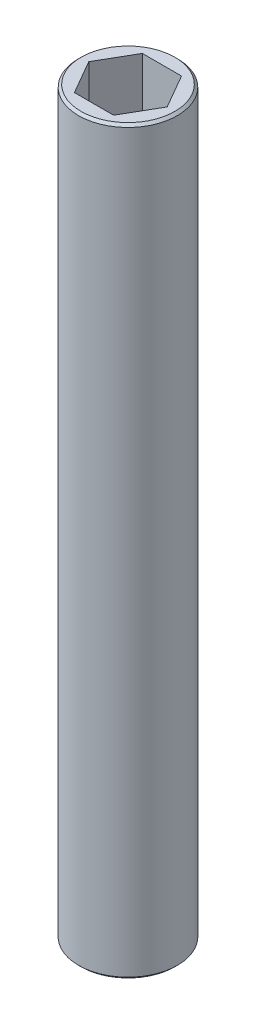
ISO-10303-21;
HEADER;
FILE_DESCRIPTION(('STEP AP214'),'2;1');
FILE_NAME('part.step','',(''),(''),'','','');
FILE_SCHEMA(('AUTOMOTIVE_DESIGN { 1 0 10303 214 1 1 1 1 }'));
ENDSEC;
DATA;
#1=APPLICATION_CONTEXT('core data for automotive mechanical design processes');
#2=APPLICATION_PROTOCOL_DEFINITION('international standard','automotive_design',2000,#1);
#3=PRODUCT_CONTEXT('',#1,'mechanical');
#4=PRODUCT('Part','Part','',(#3));
#5=PRODUCT_RELATED_PRODUCT_CATEGORY('part','',(#4));
#6=PRODUCT_DEFINITION_FORMATION('','',#4);
#7=PRODUCT_DEFINITION_CONTEXT('part definition',#1,'design');
#8=PRODUCT_DEFINITION('design','',#6,#7);
#9=PRODUCT_DEFINITION_SHAPE('','',#8);
#10=(LENGTH_UNIT() NAMED_UNIT(*) SI_UNIT(.MILLI.,.METRE.));
#11=(NAMED_UNIT(*) PLANE_ANGLE_UNIT() SI_UNIT($,.RADIAN.));
#12=(NAMED_UNIT(*) SI_UNIT($,.STERADIAN.) SOLID_ANGLE_UNIT());
#13=UNCERTAINTY_MEASURE_WITH_UNIT(LENGTH_MEASURE(1.E-05),#10,'distance_accuracy_value','');
#14=(GEOMETRIC_REPRESENTATION_CONTEXT(3) GLOBAL_UNCERTAINTY_ASSIGNED_CONTEXT((#13)) GLOBAL_UNIT_ASSIGNED_CONTEXT((#10,
#11,#12)) REPRESENTATION_CONTEXT('',''));
#15=CARTESIAN_POINT('',(0.,0.,0.));
#16=DIRECTION('',(0.,0.,1.));
#17=DIRECTION('',(1.,0.,0.));
#18=AXIS2_PLACEMENT_3D('',#15,#16,#17);
#19=CARTESIAN_POINT('',(0.,60.,0.));
#20=DIRECTION('',(0.,1.,0.));
#21=DIRECTION('',(0.,0.,1.));
#22=AXIS2_PLACEMENT_3D('',#19,#20,#21);
#23=PLANE('',#22);
#24=CARTESIAN_POINT('',(0.,60.,0.));
#25=DIRECTION('',(0.,1.,0.));
#26=DIRECTION('',(0.,0.,1.));
#27=AXIS2_PLACEMENT_3D('',#24,#25,#26);
#28=CIRCLE('',#27,3.80000000000001);
#29=CARTESIAN_POINT('',(0.,60.,3.80000000000001));
#30=VERTEX_POINT('',#29);
#31=EDGE_CURVE('E11',#30,#30,#28,.T.);
#32=ORIENTED_EDGE('',*,*,#31,.T.);
#33=EDGE_LOOP('',(#32));
#34=FACE_BOUND('',#33,.T.);
#35=DIRECTION('',(-0.500000000000001,0.,-0.866025403784438));
#36=VECTOR('',#35,1.);
#37=CARTESIAN_POINT('',(3.175,60.,0.));
#38=LINE('',#37,#36);
#39=CARTESIAN_POINT('',(3.175,60.,0.));
#40=VERTEX_POINT('',#39);
#41=CARTESIAN_POINT('',(1.58749999999999,60.,-2.7496306570156));
#42=VERTEX_POINT('',#41);
#43=EDGE_CURVE('E94',#40,#42,#38,.T.);
#44=ORIENTED_EDGE('',*,*,#43,.F.);
#45=DIRECTION('',(0.499999999999995,0.,-0.866025403784442));
#46=VECTOR('',#45,1.);
#47=CARTESIAN_POINT('',(1.58750000000003,60.,2.74963065701557));
#48=LINE('',#47,#46);
#49=CARTESIAN_POINT('',(1.58750000000003,60.,2.74963065701557));
#50=VERTEX_POINT('',#49);
#51=EDGE_CURVE('E86',#50,#40,#48,.T.);
#52=ORIENTED_EDGE('',*,*,#51,.F.);
#53=DIRECTION('',(1.,0.,0.));
#54=VECTOR('',#53,1.);
#55=CARTESIAN_POINT('',(-1.58749999999997,60.,2.74963065701561));
#56=LINE('',#55,#54);
#57=CARTESIAN_POINT('',(-1.58749999999997,60.,2.74963065701561));
#58=VERTEX_POINT('',#57);
#59=EDGE_CURVE('E115',#58,#50,#56,.T.);
#60=ORIENTED_EDGE('',*,*,#59,.F.);
#61=DIRECTION('',(0.500000000000007,0.,0.866025403784434));
#62=VECTOR('',#61,1.);
#63=CARTESIAN_POINT('',(-3.175,60.,0.));
#64=LINE('',#63,#62);
#65=CARTESIAN_POINT('',(-3.175,60.,0.));
#66=VERTEX_POINT('',#65);
#67=EDGE_CURVE('E113',#66,#58,#64,.T.);
#68=ORIENTED_EDGE('',*,*,#67,.F.);
#69=DIRECTION('',(-0.499999999999995,0.,0.866025403784441));
#70=VECTOR('',#69,1.);
#71=CARTESIAN_POINT('',(-1.58750000000001,60.,-2.74963065701558));
#72=LINE('',#71,#70);
#73=CARTESIAN_POINT('',(-1.58750000000001,60.,-2.74963065701558));
#74=VERTEX_POINT('',#73);
#75=EDGE_CURVE('E109',#74,#66,#72,.T.);
#76=ORIENTED_EDGE('',*,*,#75,.F.);
#77=DIRECTION('',(-1.,0.,0.));
#78=VECTOR('',#77,1.);
#79=CARTESIAN_POINT('',(1.58749999999999,60.,-2.7496306570156));
#80=LINE('',#79,#78);
#81=EDGE_CURVE('E107',#42,#74,#80,.T.);
#82=ORIENTED_EDGE('',*,*,#81,.F.);
#83=EDGE_LOOP('',(#44,#52,#60,#68,#76,#82));
#84=FACE_BOUND('',#83,.T.);
#85=ADVANCED_FACE('F33',(#34,#84),#23,.T.);
#86=CARTESIAN_POINT('',(0.,0.,0.));
#87=DIRECTION('',(0.,1.,0.));
#88=DIRECTION('',(0.,0.,1.));
#89=AXIS2_PLACEMENT_3D('',#86,#87,#88);
#90=PLANE('',#89);
#91=CARTESIAN_POINT('',(0.,0.,0.));
#92=DIRECTION('',(0.,1.,0.));
#93=DIRECTION('',(0.,0.,1.));
#94=AXIS2_PLACEMENT_3D('',#91,#92,#93);
#95=CIRCLE('',#94,3.8);
#96=CARTESIAN_POINT('',(0.,0.,3.8));
#97=VERTEX_POINT('',#96);
#98=EDGE_CURVE('E41',#97,#97,#95,.F.);
#99=ORIENTED_EDGE('',*,*,#98,.T.);
#100=EDGE_LOOP('',(#99));
#101=FACE_BOUND('',#100,.T.);
#102=DIRECTION('',(0.499999999999995,0.,-0.866025403784442));
#103=VECTOR('',#102,1.);
#104=CARTESIAN_POINT('',(1.58750000000003,0.,2.74963065701557));
#105=LINE('',#104,#103);
#106=CARTESIAN_POINT('',(1.58750000000003,0.,2.74963065701557));
#107=VERTEX_POINT('',#106);
#108=CARTESIAN_POINT('',(3.175,0.,0.));
#109=VERTEX_POINT('',#108);
#110=EDGE_CURVE('E56',#107,#109,#105,.T.);
#111=ORIENTED_EDGE('',*,*,#110,.T.);
#112=DIRECTION('',(-0.500000000000001,0.,-0.866025403784438));
#113=VECTOR('',#112,1.);
#114=CARTESIAN_POINT('',(3.175,0.,0.));
#115=LINE('',#114,#113);
#116=CARTESIAN_POINT('',(1.58749999999999,0.,-2.7496306570156));
#117=VERTEX_POINT('',#116);
#118=EDGE_CURVE('E101',#109,#117,#115,.T.);
#119=ORIENTED_EDGE('',*,*,#118,.T.);
#120=DIRECTION('',(-1.,0.,0.));
#121=VECTOR('',#120,1.);
#122=CARTESIAN_POINT('',(1.58749999999999,0.,-2.7496306570156));
#123=LINE('',#122,#121);
#124=CARTESIAN_POINT('',(-1.58750000000001,0.,-2.74963065701558));
#125=VERTEX_POINT('',#124);
#126=EDGE_CURVE('E119',#117,#125,#123,.T.);
#127=ORIENTED_EDGE('',*,*,#126,.T.);
#128=DIRECTION('',(-0.499999999999995,0.,0.866025403784441));
#129=VECTOR('',#128,1.);
#130=CARTESIAN_POINT('',(-1.58750000000001,0.,-2.74963065701558));
#131=LINE('',#130,#129);
#132=CARTESIAN_POINT('',(-3.175,0.,0.));
#133=VERTEX_POINT('',#132);
#134=EDGE_CURVE('E122',#125,#133,#131,.T.);
#135=ORIENTED_EDGE('',*,*,#134,.T.);
#136=DIRECTION('',(0.500000000000007,0.,0.866025403784434));
#137=VECTOR('',#136,1.);
#138=CARTESIAN_POINT('',(-3.175,0.,0.));
#139=LINE('',#138,#137);
#140=CARTESIAN_POINT('',(-1.58749999999997,0.,2.74963065701561));
#141=VERTEX_POINT('',#140);
#142=EDGE_CURVE('E125',#133,#141,#139,.T.);
#143=ORIENTED_EDGE('',*,*,#142,.T.);
#144=DIRECTION('',(1.,0.,0.));
#145=VECTOR('',#144,1.);
#146=CARTESIAN_POINT('',(-1.58749999999997,0.,2.74963065701561));
#147=LINE('',#146,#145);
#148=EDGE_CURVE('E95',#141,#107,#147,.T.);
#149=ORIENTED_EDGE('',*,*,#148,.T.);
#150=EDGE_LOOP('',(#111,#119,#127,#135,#143,#149));
#151=FACE_BOUND('',#150,.T.);
#152=ADVANCED_FACE('F144',(#101,#151),#90,.F.);
#153=CARTESIAN_POINT('',(0.,60.,0.));
#154=DIRECTION('',(0.,-1.,0.));
#155=DIRECTION('',(0.,0.,-1.));
#156=AXIS2_PLACEMENT_3D('',#153,#154,#155);
#157=CYLINDRICAL_SURFACE('',#156,4.);
#158=CARTESIAN_POINT('',(0.,0.199999999999992,0.));
#159=DIRECTION('',(0.,1.,0.));
#160=DIRECTION('',(0.,0.,1.));
#161=AXIS2_PLACEMENT_3D('',#158,#159,#160);
#162=CIRCLE('',#161,4.);
#163=CARTESIAN_POINT('',(0.,0.199999999999992,4.));
#164=VERTEX_POINT('',#163);
#165=EDGE_CURVE('E139',#164,#164,#162,.T.);
#166=ORIENTED_EDGE('',*,*,#165,.T.);
#167=EDGE_LOOP('',(#166));
#168=FACE_BOUND('',#167,.T.);
#169=CARTESIAN_POINT('',(0.,59.8,0.));
#170=DIRECTION('',(0.,1.,0.));
#171=DIRECTION('',(0.,0.,1.));
#172=AXIS2_PLACEMENT_3D('',#169,#170,#171);
#173=CIRCLE('',#172,4.);
#174=CARTESIAN_POINT('',(0.,59.8,4.));
#175=VERTEX_POINT('',#174);
#176=EDGE_CURVE('E102',#175,#175,#173,.F.);
#177=ORIENTED_EDGE('',*,*,#176,.T.);
#178=EDGE_LOOP('',(#177));
#179=FACE_BOUND('',#178,.T.);
#180=ADVANCED_FACE('F153',(#168,#179),#157,.T.);
#181=CARTESIAN_POINT('',(1.58750000000003,60.,2.74963065701557));
#182=DIRECTION('',(-0.866025403784442,0.,-0.499999999999995));
#183=DIRECTION('',(-0.499999999999995,0.,0.866025403784442));
#184=AXIS2_PLACEMENT_3D('',#181,#182,#183);
#185=PLANE('',#184);
#186=ORIENTED_EDGE('',*,*,#110,.F.);
#187=DIRECTION('',(0.,-1.,0.));
#188=VECTOR('',#187,1.);
#189=CARTESIAN_POINT('',(1.58750000000003,60.,2.74963065701557));
#190=LINE('',#189,#188);
#191=EDGE_CURVE('E90',#50,#107,#190,.T.);
#192=ORIENTED_EDGE('',*,*,#191,.F.);
#193=ORIENTED_EDGE('',*,*,#51,.T.);
#194=DIRECTION('',(0.,-1.,0.));
#195=VECTOR('',#194,1.);
#196=CARTESIAN_POINT('',(3.175,60.,0.));
#197=LINE('',#196,#195);
#198=EDGE_CURVE('E89',#40,#109,#197,.T.);
#199=ORIENTED_EDGE('',*,*,#198,.T.);
#200=EDGE_LOOP('',(#186,#192,#193,#199));
#201=FACE_BOUND('',#200,.T.);
#202=ADVANCED_FACE('F88',(#201),#185,.T.);
#203=CARTESIAN_POINT('',(3.175,60.,0.));
#204=DIRECTION('',(-0.866025403784438,0.,0.500000000000001));
#205=DIRECTION('',(0.500000000000001,0.,0.866025403784438));
#206=AXIS2_PLACEMENT_3D('',#203,#204,#205);
#207=PLANE('',#206);
#208=ORIENTED_EDGE('',*,*,#118,.F.);
#209=ORIENTED_EDGE('',*,*,#198,.F.);
#210=ORIENTED_EDGE('',*,*,#43,.T.);
#211=DIRECTION('',(0.,-1.,0.));
#212=VECTOR('',#211,1.);
#213=CARTESIAN_POINT('',(1.58749999999999,60.,-2.7496306570156));
#214=LINE('',#213,#212);
#215=EDGE_CURVE('E103',#42,#117,#214,.T.);
#216=ORIENTED_EDGE('',*,*,#215,.T.);
#217=EDGE_LOOP('',(#208,#209,#210,#216));
#218=FACE_BOUND('',#217,.T.);
#219=ADVANCED_FACE('F98',(#218),#207,.T.);
#220=CARTESIAN_POINT('',(1.58749999999999,60.,-2.7496306570156));
#221=DIRECTION('',(0.,0.,1.));
#222=DIRECTION('',(1.,0.,0.));
#223=AXIS2_PLACEMENT_3D('',#220,#221,#222);
#224=PLANE('',#223);
#225=ORIENTED_EDGE('',*,*,#126,.F.);
#226=ORIENTED_EDGE('',*,*,#215,.F.);
#227=ORIENTED_EDGE('',*,*,#81,.T.);
#228=DIRECTION('',(0.,-1.,0.));
#229=VECTOR('',#228,1.);
#230=CARTESIAN_POINT('',(-1.58750000000001,60.,-2.74963065701558));
#231=LINE('',#230,#229);
#232=EDGE_CURVE('E134',#74,#125,#231,.T.);
#233=ORIENTED_EDGE('',*,*,#232,.T.);
#234=EDGE_LOOP('',(#225,#226,#227,#233));
#235=FACE_BOUND('',#234,.T.);
#236=ADVANCED_FACE('F174',(#235),#224,.T.);
#237=CARTESIAN_POINT('',(-1.58750000000001,60.,-2.74963065701558));
#238=DIRECTION('',(0.866025403784441,0.,0.499999999999995));
#239=DIRECTION('',(0.499999999999995,0.,-0.866025403784442));
#240=AXIS2_PLACEMENT_3D('',#237,#238,#239);
#241=PLANE('',#240);
#242=ORIENTED_EDGE('',*,*,#134,.F.);
#243=ORIENTED_EDGE('',*,*,#232,.F.);
#244=ORIENTED_EDGE('',*,*,#75,.T.);
#245=DIRECTION('',(0.,-1.,0.));
#246=VECTOR('',#245,1.);
#247=CARTESIAN_POINT('',(-3.175,60.,0.));
#248=LINE('',#247,#246);
#249=EDGE_CURVE('E132',#66,#133,#248,.T.);
#250=ORIENTED_EDGE('',*,*,#249,.T.);
#251=EDGE_LOOP('',(#242,#243,#244,#250));
#252=FACE_BOUND('',#251,.T.);
#253=ADVANCED_FACE('F177',(#252),#241,.T.);
#254=CARTESIAN_POINT('',(-3.175,60.,0.));
#255=DIRECTION('',(0.866025403784435,0.,-0.500000000000007));
#256=DIRECTION('',(-0.500000000000007,0.,-0.866025403784435));
#257=AXIS2_PLACEMENT_3D('',#254,#255,#256);
#258=PLANE('',#257);
#259=ORIENTED_EDGE('',*,*,#142,.F.);
#260=ORIENTED_EDGE('',*,*,#249,.F.);
#261=ORIENTED_EDGE('',*,*,#67,.T.);
#262=DIRECTION('',(0.,-1.,0.));
#263=VECTOR('',#262,1.);
#264=CARTESIAN_POINT('',(-1.58749999999997,60.,2.74963065701561));
#265=LINE('',#264,#263);
#266=EDGE_CURVE('E48',#58,#141,#265,.T.);
#267=ORIENTED_EDGE('',*,*,#266,.T.);
#268=EDGE_LOOP('',(#259,#260,#261,#267));
#269=FACE_BOUND('',#268,.T.);
#270=ADVANCED_FACE('F181',(#269),#258,.T.);
#271=CARTESIAN_POINT('',(-1.58749999999997,60.,2.74963065701561));
#272=DIRECTION('',(0.,0.,-1.));
#273=DIRECTION('',(-1.,0.,0.));
#274=AXIS2_PLACEMENT_3D('',#271,#272,#273);
#275=PLANE('',#274);
#276=ORIENTED_EDGE('',*,*,#148,.F.);
#277=ORIENTED_EDGE('',*,*,#266,.F.);
#278=ORIENTED_EDGE('',*,*,#59,.T.);
#279=ORIENTED_EDGE('',*,*,#191,.T.);
#280=EDGE_LOOP('',(#276,#277,#278,#279));
#281=FACE_BOUND('',#280,.T.);
#282=ADVANCED_FACE('F150',(#281),#275,.T.);
#283=CARTESIAN_POINT('',(0.,0.199999999999992,0.));
#284=DIRECTION('',(0.,1.,0.));
#285=DIRECTION('',(0.,0.,1.));
#286=AXIS2_PLACEMENT_3D('',#283,#284,#285);
#287=CONICAL_SURFACE('',#286,4.,0.785398163397474);
#288=ORIENTED_EDGE('',*,*,#98,.F.);
#289=EDGE_LOOP('',(#288));
#290=FACE_BOUND('',#289,.T.);
#291=ORIENTED_EDGE('',*,*,#165,.F.);
#292=EDGE_LOOP('',(#291));
#293=FACE_BOUND('',#292,.T.);
#294=ADVANCED_FACE('F147',(#290,#293),#287,.T.);
#295=CARTESIAN_POINT('',(0.,60.,0.));
#296=DIRECTION('',(0.,-1.,0.));
#297=DIRECTION('',(0.,0.,-1.));
#298=AXIS2_PLACEMENT_3D('',#295,#296,#297);
#299=CONICAL_SURFACE('',#298,3.80000000000001,0.78539816339744);
#300=ORIENTED_EDGE('',*,*,#176,.F.);
#301=EDGE_LOOP('',(#300));
#302=FACE_BOUND('',#301,.T.);
#303=ORIENTED_EDGE('',*,*,#31,.F.);
#304=EDGE_LOOP('',(#303));
#305=FACE_BOUND('',#304,.T.);
#306=ADVANCED_FACE('F35',(#302,#305),#299,.T.);
#307=CLOSED_SHELL('',(#85,#152,#180,#202,#219,#236,#253,#270,#282,#294,#306));
#308=MANIFOLD_SOLID_BREP('B2',#307);
#309=ADVANCED_BREP_SHAPE_REPRESENTATION('',(#18,#308),#14);
#310=SHAPE_DEFINITION_REPRESENTATION(#9,#309);
ENDSEC;
END-ISO-10303-21;
